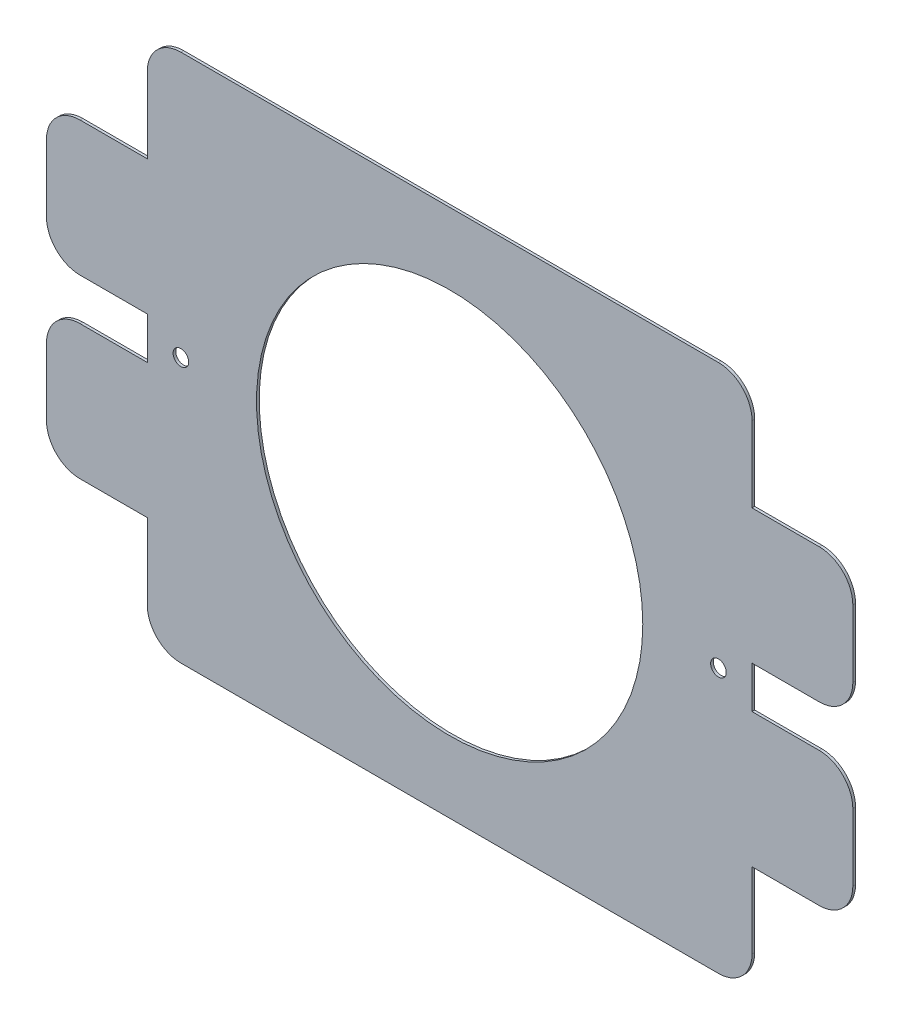
ISO-10303-21;
HEADER;
FILE_DESCRIPTION(('STEP AP214'),'2;1');
FILE_NAME('part.step','',(''),(''),'','','');
FILE_SCHEMA(('AUTOMOTIVE_DESIGN { 1 0 10303 214 1 1 1 1 }'));
ENDSEC;
DATA;
#1=APPLICATION_CONTEXT('core data for automotive mechanical design processes');
#2=APPLICATION_PROTOCOL_DEFINITION('international standard','automotive_design',2000,#1);
#3=PRODUCT_CONTEXT('',#1,'mechanical');
#4=PRODUCT('Part','Part','',(#3));
#5=PRODUCT_RELATED_PRODUCT_CATEGORY('part','',(#4));
#6=PRODUCT_DEFINITION_FORMATION('','',#4);
#7=PRODUCT_DEFINITION_CONTEXT('part definition',#1,'design');
#8=PRODUCT_DEFINITION('design','',#6,#7);
#9=PRODUCT_DEFINITION_SHAPE('','',#8);
#10=(LENGTH_UNIT() NAMED_UNIT(*) SI_UNIT(.MILLI.,.METRE.));
#11=(NAMED_UNIT(*) PLANE_ANGLE_UNIT() SI_UNIT($,.RADIAN.));
#12=(NAMED_UNIT(*) SI_UNIT($,.STERADIAN.) SOLID_ANGLE_UNIT());
#13=UNCERTAINTY_MEASURE_WITH_UNIT(LENGTH_MEASURE(1.E-05),#10,'distance_accuracy_value','');
#14=(GEOMETRIC_REPRESENTATION_CONTEXT(3) GLOBAL_UNCERTAINTY_ASSIGNED_CONTEXT((#13)) GLOBAL_UNIT_ASSIGNED_CONTEXT((#10,
#11,#12)) REPRESENTATION_CONTEXT('',''));
#15=CARTESIAN_POINT('',(0.,0.,0.));
#16=DIRECTION('',(0.,0.,1.));
#17=DIRECTION('',(1.,0.,0.));
#18=AXIS2_PLACEMENT_3D('',#15,#16,#17);
#19=CARTESIAN_POINT('',(57.15,0.,0.508));
#20=DIRECTION('',(1.,0.,0.));
#21=DIRECTION('',(0.,1.,0.));
#22=AXIS2_PLACEMENT_3D('',#19,#20,#21);
#23=PLANE('',#22);
#24=DIRECTION('',(0.,-1.,0.));
#25=VECTOR('',#24,1.);
#26=CARTESIAN_POINT('',(57.15,0.,0.));
#27=LINE('',#26,#25);
#28=CARTESIAN_POINT('',(57.15,43.65,0.));
#29=VERTEX_POINT('',#28);
#30=CARTESIAN_POINT('',(57.15,29.3666666666667,0.));
#31=VERTEX_POINT('',#30);
#32=EDGE_CURVE('E474',#29,#31,#27,.T.);
#33=ORIENTED_EDGE('',*,*,#32,.F.);
#34=DIRECTION('',(0.,0.,-1.));
#35=VECTOR('',#34,1.);
#36=CARTESIAN_POINT('',(57.15,43.65,0.508));
#37=LINE('',#36,#35);
#38=CARTESIAN_POINT('',(57.15,43.65,0.508));
#39=VERTEX_POINT('',#38);
#40=EDGE_CURVE('E429',#29,#39,#37,.F.);
#41=ORIENTED_EDGE('',*,*,#40,.T.);
#42=DIRECTION('',(0.,-1.,0.));
#43=VECTOR('',#42,1.);
#44=CARTESIAN_POINT('',(57.15,0.,0.508));
#45=LINE('',#44,#43);
#46=CARTESIAN_POINT('',(57.15,29.3666666666667,0.508));
#47=VERTEX_POINT('',#46);
#48=EDGE_CURVE('E698',#39,#47,#45,.T.);
#49=ORIENTED_EDGE('',*,*,#48,.T.);
#50=DIRECTION('',(0.,0.,-1.));
#51=VECTOR('',#50,1.);
#52=CARTESIAN_POINT('',(57.15,29.3666666666667,0.508));
#53=LINE('',#52,#51);
#54=EDGE_CURVE('E512',#47,#31,#53,.T.);
#55=ORIENTED_EDGE('',*,*,#54,.T.);
#56=EDGE_LOOP('',(#33,#41,#49,#55));
#57=FACE_BOUND('',#56,.T.);
#58=ADVANCED_FACE('F45',(#57),#23,.T.);
#59=CARTESIAN_POINT('',(0.,50.,0.508));
#60=DIRECTION('',(0.,1.,0.));
#61=DIRECTION('',(-1.,0.,0.));
#62=AXIS2_PLACEMENT_3D('',#59,#60,#61);
#63=PLANE('',#62);
#64=DIRECTION('',(1.,0.,0.));
#65=VECTOR('',#64,1.);
#66=CARTESIAN_POINT('',(0.,50.,0.));
#67=LINE('',#66,#65);
#68=CARTESIAN_POINT('',(-50.8,50.,0.));
#69=VERTEX_POINT('',#68);
#70=CARTESIAN_POINT('',(50.8,50.,0.));
#71=VERTEX_POINT('',#70);
#72=EDGE_CURVE('E485',#69,#71,#67,.T.);
#73=ORIENTED_EDGE('',*,*,#72,.F.);
#74=DIRECTION('',(0.,0.,-1.));
#75=VECTOR('',#74,1.);
#76=CARTESIAN_POINT('',(-50.8,50.,0.508));
#77=LINE('',#76,#75);
#78=CARTESIAN_POINT('',(-50.8,50.,0.508));
#79=VERTEX_POINT('',#78);
#80=EDGE_CURVE('E426',#69,#79,#77,.F.);
#81=ORIENTED_EDGE('',*,*,#80,.T.);
#82=DIRECTION('',(1.,0.,0.));
#83=VECTOR('',#82,1.);
#84=CARTESIAN_POINT('',(0.,50.,0.508));
#85=LINE('',#84,#83);
#86=CARTESIAN_POINT('',(50.8,50.,0.508));
#87=VERTEX_POINT('',#86);
#88=EDGE_CURVE('E269',#79,#87,#85,.T.);
#89=ORIENTED_EDGE('',*,*,#88,.T.);
#90=DIRECTION('',(0.,0.,-1.));
#91=VECTOR('',#90,1.);
#92=CARTESIAN_POINT('',(50.8,50.,0.508));
#93=LINE('',#92,#91);
#94=EDGE_CURVE('E422',#87,#71,#93,.T.);
#95=ORIENTED_EDGE('',*,*,#94,.T.);
#96=EDGE_LOOP('',(#73,#81,#89,#95));
#97=FACE_BOUND('',#96,.T.);
#98=ADVANCED_FACE('F654',(#97),#63,.T.);
#99=CARTESIAN_POINT('',(-57.15,0.,0.508));
#100=DIRECTION('',(1.,0.,0.));
#101=DIRECTION('',(0.,1.,0.));
#102=AXIS2_PLACEMENT_3D('',#99,#100,#101);
#103=PLANE('',#102);
#104=DIRECTION('',(0.,-1.,0.));
#105=VECTOR('',#104,1.);
#106=CARTESIAN_POINT('',(-57.15,0.,0.508));
#107=LINE('',#106,#105);
#108=CARTESIAN_POINT('',(-57.15,43.65,0.508));
#109=VERTEX_POINT('',#108);
#110=CARTESIAN_POINT('',(-57.15,29.3666666666667,0.508));
#111=VERTEX_POINT('',#110);
#112=EDGE_CURVE('E255',#109,#111,#107,.T.);
#113=ORIENTED_EDGE('',*,*,#112,.F.);
#114=DIRECTION('',(0.,0.,-1.));
#115=VECTOR('',#114,1.);
#116=CARTESIAN_POINT('',(-57.15,43.65,0.));
#117=LINE('',#116,#115);
#118=CARTESIAN_POINT('',(-57.15,43.65,0.));
#119=VERTEX_POINT('',#118);
#120=EDGE_CURVE('E419',#109,#119,#117,.T.);
#121=ORIENTED_EDGE('',*,*,#120,.T.);
#122=DIRECTION('',(0.,-1.,0.));
#123=VECTOR('',#122,1.);
#124=CARTESIAN_POINT('',(-57.15,0.,0.));
#125=LINE('',#124,#123);
#126=CARTESIAN_POINT('',(-57.15,29.3666666666667,0.));
#127=VERTEX_POINT('',#126);
#128=EDGE_CURVE('E285',#119,#127,#125,.T.);
#129=ORIENTED_EDGE('',*,*,#128,.T.);
#130=DIRECTION('',(0.,0.,-1.));
#131=VECTOR('',#130,1.);
#132=CARTESIAN_POINT('',(-57.15,29.3666666666667,0.508));
#133=LINE('',#132,#131);
#134=EDGE_CURVE('E277',#111,#127,#133,.T.);
#135=ORIENTED_EDGE('',*,*,#134,.F.);
#136=EDGE_LOOP('',(#113,#121,#129,#135));
#137=FACE_BOUND('',#136,.T.);
#138=ADVANCED_FACE('F283',(#137),#103,.F.);
#139=CARTESIAN_POINT('',(0.,29.3666666666667,0.508));
#140=DIRECTION('',(0.,-1.,0.));
#141=DIRECTION('',(1.,0.,0.));
#142=AXIS2_PLACEMENT_3D('',#139,#140,#141);
#143=PLANE('',#142);
#144=DIRECTION('',(-1.,0.,0.));
#145=VECTOR('',#144,1.);
#146=CARTESIAN_POINT('',(0.,29.3666666666667,0.));
#147=LINE('',#146,#145);
#148=CARTESIAN_POINT('',(-69.8500000000001,29.3666666666667,0.));
#149=VERTEX_POINT('',#148);
#150=EDGE_CURVE('E558',#127,#149,#147,.T.);
#151=ORIENTED_EDGE('',*,*,#150,.T.);
#152=DIRECTION('',(0.,0.,-1.));
#153=VECTOR('',#152,1.);
#154=CARTESIAN_POINT('',(-69.8500000000001,29.3666666666667,0.508));
#155=LINE('',#154,#153);
#156=CARTESIAN_POINT('',(-69.8500000000001,29.3666666666667,0.508));
#157=VERTEX_POINT('',#156);
#158=EDGE_CURVE('E279',#149,#157,#155,.F.);
#159=ORIENTED_EDGE('',*,*,#158,.T.);
#160=DIRECTION('',(-1.,0.,0.));
#161=VECTOR('',#160,1.);
#162=CARTESIAN_POINT('',(0.,29.3666666666667,0.508));
#163=LINE('',#162,#161);
#164=EDGE_CURVE('E259',#111,#157,#163,.T.);
#165=ORIENTED_EDGE('',*,*,#164,.F.);
#166=ORIENTED_EDGE('',*,*,#134,.T.);
#167=EDGE_LOOP('',(#151,#159,#165,#166));
#168=FACE_BOUND('',#167,.T.);
#169=ADVANCED_FACE('F276',(#168),#143,.F.);
#170=CARTESIAN_POINT('',(-76.2,0.,0.508));
#171=DIRECTION('',(1.,0.,0.));
#172=DIRECTION('',(0.,1.,0.));
#173=AXIS2_PLACEMENT_3D('',#170,#171,#172);
#174=PLANE('',#173);
#175=DIRECTION('',(0.,-1.,0.));
#176=VECTOR('',#175,1.);
#177=CARTESIAN_POINT('',(-76.2,0.,0.));
#178=LINE('',#177,#176);
#179=CARTESIAN_POINT('',(-76.2,23.0166666666667,0.));
#180=VERTEX_POINT('',#179);
#181=CARTESIAN_POINT('',(-76.2,10.3166666666667,0.));
#182=VERTEX_POINT('',#181);
#183=EDGE_CURVE('E554',#180,#182,#178,.T.);
#184=ORIENTED_EDGE('',*,*,#183,.T.);
#185=DIRECTION('',(0.,0.,-1.));
#186=VECTOR('',#185,1.);
#187=CARTESIAN_POINT('',(-76.2,10.3166666666667,0.508));
#188=LINE('',#187,#186);
#189=CARTESIAN_POINT('',(-76.2,10.3166666666667,0.508));
#190=VERTEX_POINT('',#189);
#191=EDGE_CURVE('E414',#182,#190,#188,.F.);
#192=ORIENTED_EDGE('',*,*,#191,.T.);
#193=DIRECTION('',(0.,-1.,0.));
#194=VECTOR('',#193,1.);
#195=CARTESIAN_POINT('',(-76.2,0.,0.508));
#196=LINE('',#195,#194);
#197=CARTESIAN_POINT('',(-76.2,23.0166666666667,0.508));
#198=VERTEX_POINT('',#197);
#199=EDGE_CURVE('E281',#198,#190,#196,.T.);
#200=ORIENTED_EDGE('',*,*,#199,.F.);
#201=DIRECTION('',(0.,0.,-1.));
#202=VECTOR('',#201,1.);
#203=CARTESIAN_POINT('',(-76.2,23.0166666666667,0.508));
#204=LINE('',#203,#202);
#205=EDGE_CURVE('E410',#198,#180,#204,.T.);
#206=ORIENTED_EDGE('',*,*,#205,.T.);
#207=EDGE_LOOP('',(#184,#192,#200,#206));
#208=FACE_BOUND('',#207,.T.);
#209=ADVANCED_FACE('F583',(#208),#174,.F.);
#210=CARTESIAN_POINT('',(0.,3.96666666666683,0.508));
#211=DIRECTION('',(0.,-1.,0.));
#212=DIRECTION('',(1.,0.,0.));
#213=AXIS2_PLACEMENT_3D('',#210,#211,#212);
#214=PLANE('',#213);
#215=DIRECTION('',(-1.,0.,0.));
#216=VECTOR('',#215,1.);
#217=CARTESIAN_POINT('',(0.,3.96666666666683,0.508));
#218=LINE('',#217,#216);
#219=CARTESIAN_POINT('',(-57.15,3.96666666666672,0.508));
#220=VERTEX_POINT('',#219);
#221=CARTESIAN_POINT('',(-69.85,3.96666666666669,0.508));
#222=VERTEX_POINT('',#221);
#223=EDGE_CURVE('E587',#220,#222,#218,.T.);
#224=ORIENTED_EDGE('',*,*,#223,.T.);
#225=DIRECTION('',(0.,0.,-1.));
#226=VECTOR('',#225,1.);
#227=CARTESIAN_POINT('',(-69.85,3.96666666666669,0.));
#228=LINE('',#227,#226);
#229=CARTESIAN_POINT('',(-69.85,3.96666666666669,0.));
#230=VERTEX_POINT('',#229);
#231=EDGE_CURVE('E406',#222,#230,#228,.T.);
#232=ORIENTED_EDGE('',*,*,#231,.T.);
#233=DIRECTION('',(-1.,0.,0.));
#234=VECTOR('',#233,1.);
#235=CARTESIAN_POINT('',(0.,3.96666666666683,0.));
#236=LINE('',#235,#234);
#237=CARTESIAN_POINT('',(-57.15,3.96666666666672,0.));
#238=VERTEX_POINT('',#237);
#239=EDGE_CURVE('E548',#238,#230,#236,.T.);
#240=ORIENTED_EDGE('',*,*,#239,.F.);
#241=DIRECTION('',(0.,0.,-1.));
#242=VECTOR('',#241,1.);
#243=CARTESIAN_POINT('',(-57.15,3.96666666666672,0.508));
#244=LINE('',#243,#242);
#245=EDGE_CURVE('E289',#220,#238,#244,.T.);
#246=ORIENTED_EDGE('',*,*,#245,.F.);
#247=EDGE_LOOP('',(#224,#232,#240,#246));
#248=FACE_BOUND('',#247,.T.);
#249=ADVANCED_FACE('F818',(#248),#214,.T.);
#250=CARTESIAN_POINT('',(-57.15,-3.96666666666696,0.));
#251=VERTEX_POINT('',#250);
#252=EDGE_CURVE('E543',#238,#251,#125,.T.);
#253=ORIENTED_EDGE('',*,*,#252,.T.);
#254=DIRECTION('',(0.,0.,-1.));
#255=VECTOR('',#254,1.);
#256=CARTESIAN_POINT('',(-57.15,-3.96666666666696,0.508));
#257=LINE('',#256,#255);
#258=CARTESIAN_POINT('',(-57.15,-3.96666666666696,0.508));
#259=VERTEX_POINT('',#258);
#260=EDGE_CURVE('E295',#259,#251,#257,.T.);
#261=ORIENTED_EDGE('',*,*,#260,.F.);
#262=EDGE_CURVE('E272',#220,#259,#107,.T.);
#263=ORIENTED_EDGE('',*,*,#262,.F.);
#264=ORIENTED_EDGE('',*,*,#245,.T.);
#265=EDGE_LOOP('',(#253,#261,#263,#264));
#266=FACE_BOUND('',#265,.T.);
#267=ADVANCED_FACE('F544',(#266),#103,.F.);
#268=CARTESIAN_POINT('',(0.,-3.96666666666736,0.508));
#269=DIRECTION('',(0.,-1.,0.));
#270=DIRECTION('',(1.,0.,0.));
#271=AXIS2_PLACEMENT_3D('',#268,#269,#270);
#272=PLANE('',#271);
#273=DIRECTION('',(-1.,0.,0.));
#274=VECTOR('',#273,1.);
#275=CARTESIAN_POINT('',(0.,-3.96666666666736,0.));
#276=LINE('',#275,#274);
#277=CARTESIAN_POINT('',(-69.85,-3.96666666666694,0.));
#278=VERTEX_POINT('',#277);
#279=EDGE_CURVE('E535',#251,#278,#276,.T.);
#280=ORIENTED_EDGE('',*,*,#279,.T.);
#281=DIRECTION('',(0.,0.,-1.));
#282=VECTOR('',#281,1.);
#283=CARTESIAN_POINT('',(-69.85,-3.96666666666694,0.508));
#284=LINE('',#283,#282);
#285=CARTESIAN_POINT('',(-69.85,-3.96666666666694,0.508));
#286=VERTEX_POINT('',#285);
#287=EDGE_CURVE('E403',#278,#286,#284,.F.);
#288=ORIENTED_EDGE('',*,*,#287,.T.);
#289=DIRECTION('',(-1.,0.,0.));
#290=VECTOR('',#289,1.);
#291=CARTESIAN_POINT('',(0.,-3.96666666666736,0.508));
#292=LINE('',#291,#290);
#293=EDGE_CURVE('E538',#259,#286,#292,.T.);
#294=ORIENTED_EDGE('',*,*,#293,.F.);
#295=ORIENTED_EDGE('',*,*,#260,.T.);
#296=EDGE_LOOP('',(#280,#288,#294,#295));
#297=FACE_BOUND('',#296,.T.);
#298=ADVANCED_FACE('F534',(#297),#272,.F.);
#299=CARTESIAN_POINT('',(-76.2,0.,0.508));
#300=DIRECTION('',(1.,0.,0.));
#301=DIRECTION('',(0.,1.,0.));
#302=AXIS2_PLACEMENT_3D('',#299,#300,#301);
#303=PLANE('',#302);
#304=DIRECTION('',(0.,-1.,0.));
#305=VECTOR('',#304,1.);
#306=CARTESIAN_POINT('',(-76.2,0.,0.));
#307=LINE('',#306,#305);
#308=CARTESIAN_POINT('',(-76.2,-10.3166666666669,0.));
#309=VERTEX_POINT('',#308);
#310=CARTESIAN_POINT('',(-76.2,-23.0166666666669,0.));
#311=VERTEX_POINT('',#310);
#312=EDGE_CURVE('E552',#309,#311,#307,.T.);
#313=ORIENTED_EDGE('',*,*,#312,.T.);
#314=DIRECTION('',(0.,0.,-1.));
#315=VECTOR('',#314,1.);
#316=CARTESIAN_POINT('',(-76.2,-23.0166666666669,0.508));
#317=LINE('',#316,#315);
#318=CARTESIAN_POINT('',(-76.2,-23.0166666666669,0.508));
#319=VERTEX_POINT('',#318);
#320=EDGE_CURVE('E400',#311,#319,#317,.F.);
#321=ORIENTED_EDGE('',*,*,#320,.T.);
#322=DIRECTION('',(0.,-1.,0.));
#323=VECTOR('',#322,1.);
#324=CARTESIAN_POINT('',(-76.2,0.,0.508));
#325=LINE('',#324,#323);
#326=CARTESIAN_POINT('',(-76.2,-10.3166666666669,0.508));
#327=VERTEX_POINT('',#326);
#328=EDGE_CURVE('E595',#327,#319,#325,.T.);
#329=ORIENTED_EDGE('',*,*,#328,.F.);
#330=DIRECTION('',(0.,0.,-1.));
#331=VECTOR('',#330,1.);
#332=CARTESIAN_POINT('',(-76.2,-10.3166666666669,0.508));
#333=LINE('',#332,#331);
#334=EDGE_CURVE('E396',#327,#309,#333,.T.);
#335=ORIENTED_EDGE('',*,*,#334,.T.);
#336=EDGE_LOOP('',(#313,#321,#329,#335));
#337=FACE_BOUND('',#336,.T.);
#338=ADVANCED_FACE('F800',(#337),#303,.F.);
#339=CARTESIAN_POINT('',(1.6045053882788E-13,-29.3666666666665,0.508));
#340=DIRECTION('',(0.,-1.,0.));
#341=DIRECTION('',(1.,0.,0.));
#342=AXIS2_PLACEMENT_3D('',#339,#340,#341);
#343=PLANE('',#342);
#344=DIRECTION('',(-1.,0.,0.));
#345=VECTOR('',#344,1.);
#346=CARTESIAN_POINT('',(1.6045053882788E-13,-29.3666666666665,0.508));
#347=LINE('',#346,#345);
#348=CARTESIAN_POINT('',(-57.15,-29.3666666666668,0.508));
#349=VERTEX_POINT('',#348);
#350=CARTESIAN_POINT('',(-69.85,-29.3666666666669,0.508));
#351=VERTEX_POINT('',#350);
#352=EDGE_CURVE('E599',#349,#351,#347,.T.);
#353=ORIENTED_EDGE('',*,*,#352,.T.);
#354=DIRECTION('',(0.,0.,-1.));
#355=VECTOR('',#354,1.);
#356=CARTESIAN_POINT('',(-69.85,-29.3666666666669,0.));
#357=LINE('',#356,#355);
#358=CARTESIAN_POINT('',(-69.85,-29.3666666666669,0.));
#359=VERTEX_POINT('',#358);
#360=EDGE_CURVE('E392',#351,#359,#357,.T.);
#361=ORIENTED_EDGE('',*,*,#360,.T.);
#362=DIRECTION('',(-1.,0.,0.));
#363=VECTOR('',#362,1.);
#364=CARTESIAN_POINT('',(1.6045053882788E-13,-29.3666666666665,0.));
#365=LINE('',#364,#363);
#366=CARTESIAN_POINT('',(-57.15,-29.3666666666668,0.));
#367=VERTEX_POINT('',#366);
#368=EDGE_CURVE('E561',#367,#359,#365,.T.);
#369=ORIENTED_EDGE('',*,*,#368,.F.);
#370=DIRECTION('',(0.,0.,-1.));
#371=VECTOR('',#370,1.);
#372=CARTESIAN_POINT('',(-57.15,-29.3666666666668,0.508));
#373=LINE('',#372,#371);
#374=EDGE_CURVE('E526',#349,#367,#373,.T.);
#375=ORIENTED_EDGE('',*,*,#374,.F.);
#376=EDGE_LOOP('',(#353,#361,#369,#375));
#377=FACE_BOUND('',#376,.T.);
#378=ADVANCED_FACE('F792',(#377),#343,.T.);
#379=CARTESIAN_POINT('',(-57.15,-43.65,0.));
#380=VERTEX_POINT('',#379);
#381=EDGE_CURVE('E480',#367,#380,#125,.T.);
#382=ORIENTED_EDGE('',*,*,#381,.T.);
#383=DIRECTION('',(0.,0.,-1.));
#384=VECTOR('',#383,1.);
#385=CARTESIAN_POINT('',(-57.15,-43.65,0.508));
#386=LINE('',#385,#384);
#387=CARTESIAN_POINT('',(-57.15,-43.65,0.508));
#388=VERTEX_POINT('',#387);
#389=EDGE_CURVE('E11',#380,#388,#386,.F.);
#390=ORIENTED_EDGE('',*,*,#389,.T.);
#391=EDGE_CURVE('E271',#349,#388,#107,.T.);
#392=ORIENTED_EDGE('',*,*,#391,.F.);
#393=ORIENTED_EDGE('',*,*,#374,.T.);
#394=EDGE_LOOP('',(#382,#390,#392,#393));
#395=FACE_BOUND('',#394,.T.);
#396=ADVANCED_FACE('F807',(#395),#103,.F.);
#397=CARTESIAN_POINT('',(0.,-50.,0.508));
#398=DIRECTION('',(0.,1.,0.));
#399=DIRECTION('',(-1.,0.,0.));
#400=AXIS2_PLACEMENT_3D('',#397,#398,#399);
#401=PLANE('',#400);
#402=DIRECTION('',(1.,0.,0.));
#403=VECTOR('',#402,1.);
#404=CARTESIAN_POINT('',(0.,-50.,0.));
#405=LINE('',#404,#403);
#406=CARTESIAN_POINT('',(-50.8,-50.,0.));
#407=VERTEX_POINT('',#406);
#408=CARTESIAN_POINT('',(50.8,-50.,0.));
#409=VERTEX_POINT('',#408);
#410=EDGE_CURVE('E449',#407,#409,#405,.T.);
#411=ORIENTED_EDGE('',*,*,#410,.T.);
#412=DIRECTION('',(0.,0.,-1.));
#413=VECTOR('',#412,1.);
#414=CARTESIAN_POINT('',(50.8,-50.,0.508));
#415=LINE('',#414,#413);
#416=CARTESIAN_POINT('',(50.8,-50.,0.508));
#417=VERTEX_POINT('',#416);
#418=EDGE_CURVE('E54',#409,#417,#415,.F.);
#419=ORIENTED_EDGE('',*,*,#418,.T.);
#420=DIRECTION('',(1.,0.,0.));
#421=VECTOR('',#420,1.);
#422=CARTESIAN_POINT('',(0.,-50.,0.508));
#423=LINE('',#422,#421);
#424=CARTESIAN_POINT('',(-50.8,-50.,0.508));
#425=VERTEX_POINT('',#424);
#426=EDGE_CURVE('E446',#425,#417,#423,.T.);
#427=ORIENTED_EDGE('',*,*,#426,.F.);
#428=DIRECTION('',(0.,0.,-1.));
#429=VECTOR('',#428,1.);
#430=CARTESIAN_POINT('',(-50.8,-50.,0.508));
#431=LINE('',#430,#429);
#432=EDGE_CURVE('E436',#425,#407,#431,.T.);
#433=ORIENTED_EDGE('',*,*,#432,.T.);
#434=EDGE_LOOP('',(#411,#419,#427,#433));
#435=FACE_BOUND('',#434,.T.);
#436=ADVANCED_FACE('F445',(#435),#401,.F.);
#437=CARTESIAN_POINT('',(57.15,-29.3666666666666,0.508));
#438=VERTEX_POINT('',#437);
#439=CARTESIAN_POINT('',(57.15,-43.65,0.508));
#440=VERTEX_POINT('',#439);
#441=EDGE_CURVE('E457',#438,#440,#45,.T.);
#442=ORIENTED_EDGE('',*,*,#441,.T.);
#443=DIRECTION('',(0.,0.,-1.));
#444=VECTOR('',#443,1.);
#445=CARTESIAN_POINT('',(57.15,-43.65,0.));
#446=LINE('',#445,#444);
#447=CARTESIAN_POINT('',(57.15,-43.65,0.));
#448=VERTEX_POINT('',#447);
#449=EDGE_CURVE('E432',#440,#448,#446,.T.);
#450=ORIENTED_EDGE('',*,*,#449,.T.);
#451=CARTESIAN_POINT('',(57.15,-29.3666666666666,0.));
#452=VERTEX_POINT('',#451);
#453=EDGE_CURVE('E465',#452,#448,#27,.T.);
#454=ORIENTED_EDGE('',*,*,#453,.F.);
#455=DIRECTION('',(0.,0.,-1.));
#456=VECTOR('',#455,1.);
#457=CARTESIAN_POINT('',(57.15,-29.3666666666666,0.508));
#458=LINE('',#457,#456);
#459=EDGE_CURVE('E523',#438,#452,#458,.T.);
#460=ORIENTED_EDGE('',*,*,#459,.F.);
#461=EDGE_LOOP('',(#442,#450,#454,#460));
#462=FACE_BOUND('',#461,.T.);
#463=ADVANCED_FACE('F464',(#462),#23,.T.);
#464=CARTESIAN_POINT('',(-2.83462618595919E-13,-29.3666666666661,0.508));
#465=DIRECTION('',(0.,1.,0.));
#466=DIRECTION('',(-1.,0.,0.));
#467=AXIS2_PLACEMENT_3D('',#464,#465,#466);
#468=PLANE('',#467);
#469=DIRECTION('',(1.,0.,0.));
#470=VECTOR('',#469,1.);
#471=CARTESIAN_POINT('',(-2.83462618595919E-13,-29.3666666666661,0.));
#472=LINE('',#471,#470);
#473=CARTESIAN_POINT('',(69.8499999999999,-29.3666666666668,0.));
#474=VERTEX_POINT('',#473);
#475=EDGE_CURVE('E471',#452,#474,#472,.T.);
#476=ORIENTED_EDGE('',*,*,#475,.T.);
#477=DIRECTION('',(0.,0.,-1.));
#478=VECTOR('',#477,1.);
#479=CARTESIAN_POINT('',(69.8499999999999,-29.3666666666668,0.508));
#480=LINE('',#479,#478);
#481=CARTESIAN_POINT('',(69.8499999999999,-29.3666666666668,0.508));
#482=VERTEX_POINT('',#481);
#483=EDGE_CURVE('E338',#474,#482,#480,.F.);
#484=ORIENTED_EDGE('',*,*,#483,.T.);
#485=DIRECTION('',(1.,0.,0.));
#486=VECTOR('',#485,1.);
#487=CARTESIAN_POINT('',(-2.83462618595919E-13,-29.3666666666661,0.508));
#488=LINE('',#487,#486);
#489=EDGE_CURVE('E603',#438,#482,#488,.T.);
#490=ORIENTED_EDGE('',*,*,#489,.F.);
#491=ORIENTED_EDGE('',*,*,#459,.T.);
#492=EDGE_LOOP('',(#476,#484,#490,#491));
#493=FACE_BOUND('',#492,.T.);
#494=ADVANCED_FACE('F666',(#493),#468,.F.);
#495=CARTESIAN_POINT('',(76.2,0.,0.508));
#496=DIRECTION('',(1.,0.,0.));
#497=DIRECTION('',(0.,0.,-1.));
#498=AXIS2_PLACEMENT_3D('',#495,#496,#497);
#499=PLANE('',#498);
#500=DIRECTION('',(0.,-1.,0.));
#501=VECTOR('',#500,1.);
#502=CARTESIAN_POINT('',(76.2,0.,0.508));
#503=LINE('',#502,#501);
#504=CARTESIAN_POINT('',(76.2,-10.3166666666669,0.508));
#505=VERTEX_POINT('',#504);
#506=CARTESIAN_POINT('',(76.2,-23.0166666666668,0.508));
#507=VERTEX_POINT('',#506);
#508=EDGE_CURVE('E606',#505,#507,#503,.T.);
#509=ORIENTED_EDGE('',*,*,#508,.T.);
#510=DIRECTION('',(0.,0.,-1.));
#511=VECTOR('',#510,1.);
#512=CARTESIAN_POINT('',(76.2,-23.0166666666668,0.));
#513=LINE('',#512,#511);
#514=CARTESIAN_POINT('',(76.2,-23.0166666666668,0.));
#515=VERTEX_POINT('',#514);
#516=EDGE_CURVE('E293',#507,#515,#513,.T.);
#517=ORIENTED_EDGE('',*,*,#516,.T.);
#518=DIRECTION('',(0.,-1.,0.));
#519=VECTOR('',#518,1.);
#520=CARTESIAN_POINT('',(76.2,0.,0.));
#521=LINE('',#520,#519);
#522=CARTESIAN_POINT('',(76.2,-10.3166666666669,0.));
#523=VERTEX_POINT('',#522);
#524=EDGE_CURVE('E478',#523,#515,#521,.T.);
#525=ORIENTED_EDGE('',*,*,#524,.F.);
#526=DIRECTION('',(0.,0.,-1.));
#527=VECTOR('',#526,1.);
#528=CARTESIAN_POINT('',(76.2,-10.3166666666669,0.508));
#529=LINE('',#528,#527);
#530=EDGE_CURVE('E288',#523,#505,#529,.F.);
#531=ORIENTED_EDGE('',*,*,#530,.T.);
#532=EDGE_LOOP('',(#509,#517,#525,#531));
#533=FACE_BOUND('',#532,.T.);
#534=ADVANCED_FACE('F675',(#533),#499,.T.);
#535=CARTESIAN_POINT('',(0.,-3.96666666666754,0.508));
#536=DIRECTION('',(0.,1.,0.));
#537=DIRECTION('',(-1.,0.,0.));
#538=AXIS2_PLACEMENT_3D('',#535,#536,#537);
#539=PLANE('',#538);
#540=DIRECTION('',(1.,0.,0.));
#541=VECTOR('',#540,1.);
#542=CARTESIAN_POINT('',(0.,-3.96666666666754,0.508));
#543=LINE('',#542,#541);
#544=CARTESIAN_POINT('',(57.15,-3.96666666666691,0.508));
#545=VERTEX_POINT('',#544);
#546=CARTESIAN_POINT('',(69.8499999999999,-3.96666666666688,0.508));
#547=VERTEX_POINT('',#546);
#548=EDGE_CURVE('E610',#545,#547,#543,.T.);
#549=ORIENTED_EDGE('',*,*,#548,.T.);
#550=DIRECTION('',(0.,0.,-1.));
#551=VECTOR('',#550,1.);
#552=CARTESIAN_POINT('',(69.8499999999999,-3.96666666666688,0.508));
#553=LINE('',#552,#551);
#554=CARTESIAN_POINT('',(69.8499999999999,-3.96666666666688,0.));
#555=VERTEX_POINT('',#554);
#556=EDGE_CURVE('E388',#547,#555,#553,.T.);
#557=ORIENTED_EDGE('',*,*,#556,.T.);
#558=DIRECTION('',(1.,0.,0.));
#559=VECTOR('',#558,1.);
#560=CARTESIAN_POINT('',(0.,-3.96666666666754,0.));
#561=LINE('',#560,#559);
#562=CARTESIAN_POINT('',(57.15,-3.96666666666691,0.));
#563=VERTEX_POINT('',#562);
#564=EDGE_CURVE('E490',#563,#555,#561,.T.);
#565=ORIENTED_EDGE('',*,*,#564,.F.);
#566=DIRECTION('',(0.,0.,-1.));
#567=VECTOR('',#566,1.);
#568=CARTESIAN_POINT('',(57.15,-3.96666666666691,0.508));
#569=LINE('',#568,#567);
#570=EDGE_CURVE('E520',#545,#563,#569,.T.);
#571=ORIENTED_EDGE('',*,*,#570,.F.);
#572=EDGE_LOOP('',(#549,#557,#565,#571));
#573=FACE_BOUND('',#572,.T.);
#574=ADVANCED_FACE('F668',(#573),#539,.T.);
#575=CARTESIAN_POINT('',(57.15,3.96666666666688,0.));
#576=VERTEX_POINT('',#575);
#577=EDGE_CURVE('E475',#576,#563,#27,.T.);
#578=ORIENTED_EDGE('',*,*,#577,.F.);
#579=DIRECTION('',(0.,0.,-1.));
#580=VECTOR('',#579,1.);
#581=CARTESIAN_POINT('',(57.15,3.96666666666688,0.508));
#582=LINE('',#581,#580);
#583=CARTESIAN_POINT('',(57.15,3.96666666666688,0.508));
#584=VERTEX_POINT('',#583);
#585=EDGE_CURVE('E516',#584,#576,#582,.T.);
#586=ORIENTED_EDGE('',*,*,#585,.F.);
#587=EDGE_CURVE('E614',#584,#545,#45,.T.);
#588=ORIENTED_EDGE('',*,*,#587,.T.);
#589=ORIENTED_EDGE('',*,*,#570,.T.);
#590=EDGE_LOOP('',(#578,#586,#588,#589));
#591=FACE_BOUND('',#590,.T.);
#592=ADVANCED_FACE('F657',(#591),#23,.T.);
#593=CARTESIAN_POINT('',(0.,3.96666666666723,0.508));
#594=DIRECTION('',(0.,1.,0.));
#595=DIRECTION('',(-1.,0.,0.));
#596=AXIS2_PLACEMENT_3D('',#593,#594,#595);
#597=PLANE('',#596);
#598=DIRECTION('',(1.,0.,0.));
#599=VECTOR('',#598,1.);
#600=CARTESIAN_POINT('',(0.,3.96666666666723,0.));
#601=LINE('',#600,#599);
#602=CARTESIAN_POINT('',(69.8499999999999,3.9666666666668,0.));
#603=VERTEX_POINT('',#602);
#604=EDGE_CURVE('E489',#576,#603,#601,.T.);
#605=ORIENTED_EDGE('',*,*,#604,.T.);
#606=DIRECTION('',(0.,0.,-1.));
#607=VECTOR('',#606,1.);
#608=CARTESIAN_POINT('',(69.8499999999999,3.9666666666668,0.508));
#609=LINE('',#608,#607);
#610=CARTESIAN_POINT('',(69.8499999999999,3.9666666666668,0.508));
#611=VERTEX_POINT('',#610);
#612=EDGE_CURVE('E385',#603,#611,#609,.F.);
#613=ORIENTED_EDGE('',*,*,#612,.T.);
#614=DIRECTION('',(1.,0.,0.));
#615=VECTOR('',#614,1.);
#616=CARTESIAN_POINT('',(0.,3.96666666666723,0.508));
#617=LINE('',#616,#615);
#618=EDGE_CURVE('E615',#584,#611,#617,.T.);
#619=ORIENTED_EDGE('',*,*,#618,.F.);
#620=ORIENTED_EDGE('',*,*,#585,.T.);
#621=EDGE_LOOP('',(#605,#613,#619,#620));
#622=FACE_BOUND('',#621,.T.);
#623=ADVANCED_FACE('F648',(#622),#597,.F.);
#624=CARTESIAN_POINT('',(76.2,0.,0.508));
#625=DIRECTION('',(1.,0.,0.));
#626=DIRECTION('',(0.,1.,0.));
#627=AXIS2_PLACEMENT_3D('',#624,#625,#626);
#628=PLANE('',#627);
#629=DIRECTION('',(0.,-1.,0.));
#630=VECTOR('',#629,1.);
#631=CARTESIAN_POINT('',(76.2,0.,0.));
#632=LINE('',#631,#630);
#633=CARTESIAN_POINT('',(76.1999999999999,23.0166666666667,0.));
#634=VERTEX_POINT('',#633);
#635=CARTESIAN_POINT('',(76.1999999999999,10.3166666666668,0.));
#636=VERTEX_POINT('',#635);
#637=EDGE_CURVE('E497',#634,#636,#632,.T.);
#638=ORIENTED_EDGE('',*,*,#637,.F.);
#639=DIRECTION('',(0.,0.,-1.));
#640=VECTOR('',#639,1.);
#641=CARTESIAN_POINT('',(76.1999999999999,23.0166666666667,0.508));
#642=LINE('',#641,#640);
#643=CARTESIAN_POINT('',(76.1999999999999,23.0166666666667,0.508));
#644=VERTEX_POINT('',#643);
#645=EDGE_CURVE('E382',#634,#644,#642,.F.);
#646=ORIENTED_EDGE('',*,*,#645,.T.);
#647=DIRECTION('',(0.,-1.,0.));
#648=VECTOR('',#647,1.);
#649=CARTESIAN_POINT('',(76.2,0.,0.508));
#650=LINE('',#649,#648);
#651=CARTESIAN_POINT('',(76.1999999999999,10.3166666666668,0.508));
#652=VERTEX_POINT('',#651);
#653=EDGE_CURVE('E618',#644,#652,#650,.T.);
#654=ORIENTED_EDGE('',*,*,#653,.T.);
#655=DIRECTION('',(0.,0.,-1.));
#656=VECTOR('',#655,1.);
#657=CARTESIAN_POINT('',(76.1999999999999,10.3166666666668,0.));
#658=LINE('',#657,#656);
#659=EDGE_CURVE('E378',#652,#636,#658,.T.);
#660=ORIENTED_EDGE('',*,*,#659,.T.);
#661=EDGE_LOOP('',(#638,#646,#654,#660));
#662=FACE_BOUND('',#661,.T.);
#663=ADVANCED_FACE('F638',(#662),#628,.T.);
#664=CARTESIAN_POINT('',(0.,0.,0.508));
#665=DIRECTION('',(0.,0.,-1.));
#666=DIRECTION('',(-1.,0.,0.));
#667=AXIS2_PLACEMENT_3D('',#664,#665,#666);
#668=CYLINDRICAL_SURFACE('',#667,36.5);
#669=CARTESIAN_POINT('',(0.,0.,0.508));
#670=DIRECTION('',(0.,0.,1.));
#671=DIRECTION('',(1.,0.,0.));
#672=AXIS2_PLACEMENT_3D('',#669,#670,#671);
#673=CIRCLE('',#672,36.5);
#674=CARTESIAN_POINT('',(36.5,0.,0.508));
#675=VERTEX_POINT('',#674);
#676=EDGE_CURVE('E702',#675,#675,#673,.T.);
#677=ORIENTED_EDGE('',*,*,#676,.T.);
#678=EDGE_LOOP('',(#677));
#679=FACE_BOUND('',#678,.T.);
#680=CARTESIAN_POINT('',(0.,0.,0.));
#681=DIRECTION('',(0.,0.,1.));
#682=DIRECTION('',(1.,0.,0.));
#683=AXIS2_PLACEMENT_3D('',#680,#681,#682);
#684=CIRCLE('',#683,36.5);
#685=CARTESIAN_POINT('',(36.5,0.,0.));
#686=VERTEX_POINT('',#685);
#687=EDGE_CURVE('E486',#686,#686,#684,.T.);
#688=ORIENTED_EDGE('',*,*,#687,.F.);
#689=EDGE_LOOP('',(#688));
#690=FACE_BOUND('',#689,.T.);
#691=ADVANCED_FACE('F635',(#679,#690),#668,.F.);
#692=CARTESIAN_POINT('',(-50.8,0.,0.508));
#693=DIRECTION('',(0.,0.,-1.));
#694=DIRECTION('',(-1.,0.,0.));
#695=AXIS2_PLACEMENT_3D('',#692,#693,#694);
#696=CYLINDRICAL_SURFACE('',#695,1.475);
#697=CARTESIAN_POINT('',(-50.8,0.,0.508));
#698=DIRECTION('',(0.,0.,1.));
#699=DIRECTION('',(1.,0.,0.));
#700=AXIS2_PLACEMENT_3D('',#697,#698,#699);
#701=CIRCLE('',#700,1.475);
#702=CARTESIAN_POINT('',(-49.325,0.,0.508));
#703=VERTEX_POINT('',#702);
#704=EDGE_CURVE('E709',#703,#703,#701,.T.);
#705=ORIENTED_EDGE('',*,*,#704,.T.);
#706=EDGE_LOOP('',(#705));
#707=FACE_BOUND('',#706,.T.);
#708=CARTESIAN_POINT('',(-50.8,0.,0.));
#709=DIRECTION('',(0.,0.,1.));
#710=DIRECTION('',(1.,0.,0.));
#711=AXIS2_PLACEMENT_3D('',#708,#709,#710);
#712=CIRCLE('',#711,1.475);
#713=CARTESIAN_POINT('',(-49.325,0.,0.));
#714=VERTEX_POINT('',#713);
#715=EDGE_CURVE('E627',#714,#714,#712,.T.);
#716=ORIENTED_EDGE('',*,*,#715,.F.);
#717=EDGE_LOOP('',(#716));
#718=FACE_BOUND('',#717,.T.);
#719=ADVANCED_FACE('F637',(#707,#718),#696,.F.);
#720=CARTESIAN_POINT('',(50.8,0.,0.508));
#721=DIRECTION('',(0.,0.,-1.));
#722=DIRECTION('',(-1.,0.,0.));
#723=AXIS2_PLACEMENT_3D('',#720,#721,#722);
#724=CYLINDRICAL_SURFACE('',#723,1.47500000000001);
#725=CARTESIAN_POINT('',(50.8,0.,0.508));
#726=DIRECTION('',(0.,0.,1.));
#727=DIRECTION('',(1.,0.,0.));
#728=AXIS2_PLACEMENT_3D('',#725,#726,#727);
#729=CIRCLE('',#728,1.47500000000001);
#730=CARTESIAN_POINT('',(52.275,0.,0.508));
#731=VERTEX_POINT('',#730);
#732=EDGE_CURVE('E511',#731,#731,#729,.T.);
#733=ORIENTED_EDGE('',*,*,#732,.T.);
#734=EDGE_LOOP('',(#733));
#735=FACE_BOUND('',#734,.T.);
#736=CARTESIAN_POINT('',(50.8,0.,0.));
#737=DIRECTION('',(0.,0.,1.));
#738=DIRECTION('',(1.,0.,0.));
#739=AXIS2_PLACEMENT_3D('',#736,#737,#738);
#740=CIRCLE('',#739,1.47500000000001);
#741=CARTESIAN_POINT('',(52.275,0.,0.));
#742=VERTEX_POINT('',#741);
#743=EDGE_CURVE('E623',#742,#742,#740,.T.);
#744=ORIENTED_EDGE('',*,*,#743,.F.);
#745=EDGE_LOOP('',(#744));
#746=FACE_BOUND('',#745,.T.);
#747=ADVANCED_FACE('F645',(#735,#746),#724,.F.);
#748=CARTESIAN_POINT('',(0.,29.3666666666665,0.508));
#749=DIRECTION('',(0.,1.,0.));
#750=DIRECTION('',(-1.,0.,0.));
#751=AXIS2_PLACEMENT_3D('',#748,#749,#750);
#752=PLANE('',#751);
#753=DIRECTION('',(1.,0.,0.));
#754=VECTOR('',#753,1.);
#755=CARTESIAN_POINT('',(0.,29.3666666666665,0.508));
#756=LINE('',#755,#754);
#757=CARTESIAN_POINT('',(69.8499999999999,29.3666666666667,0.508));
#758=VERTEX_POINT('',#757);
#759=EDGE_CURVE('E517',#47,#758,#756,.T.);
#760=ORIENTED_EDGE('',*,*,#759,.T.);
#761=DIRECTION('',(0.,0.,-1.));
#762=VECTOR('',#761,1.);
#763=CARTESIAN_POINT('',(69.8499999999999,29.3666666666667,0.508));
#764=LINE('',#763,#762);
#765=CARTESIAN_POINT('',(69.8499999999999,29.3666666666667,0.));
#766=VERTEX_POINT('',#765);
#767=EDGE_CURVE('E374',#758,#766,#764,.T.);
#768=ORIENTED_EDGE('',*,*,#767,.T.);
#769=DIRECTION('',(1.,0.,0.));
#770=VECTOR('',#769,1.);
#771=CARTESIAN_POINT('',(0.,29.3666666666665,0.));
#772=LINE('',#771,#770);
#773=EDGE_CURVE('E507',#31,#766,#772,.T.);
#774=ORIENTED_EDGE('',*,*,#773,.F.);
#775=ORIENTED_EDGE('',*,*,#54,.F.);
#776=EDGE_LOOP('',(#760,#768,#774,#775));
#777=FACE_BOUND('',#776,.T.);
#778=ADVANCED_FACE('F723',(#777),#752,.T.);
#779=CARTESIAN_POINT('',(0.,0.,0.508));
#780=DIRECTION('',(0.,0.,1.));
#781=DIRECTION('',(1.,0.,0.));
#782=AXIS2_PLACEMENT_3D('',#779,#780,#781);
#783=PLANE('',#782);
#784=ORIENTED_EDGE('',*,*,#732,.F.);
#785=EDGE_LOOP('',(#784));
#786=FACE_BOUND('',#785,.T.);
#787=ORIENTED_EDGE('',*,*,#704,.F.);
#788=EDGE_LOOP('',(#787));
#789=FACE_BOUND('',#788,.T.);
#790=ORIENTED_EDGE('',*,*,#676,.F.);
#791=EDGE_LOOP('',(#790));
#792=FACE_BOUND('',#791,.T.);
#793=ORIENTED_EDGE('',*,*,#489,.T.);
#794=CARTESIAN_POINT('',(69.85,-23.0166666666668,0.508));
#795=DIRECTION('',(0.,0.,1.));
#796=DIRECTION('',(1.,0.,0.));
#797=AXIS2_PLACEMENT_3D('',#794,#795,#796);
#798=CIRCLE('',#797,6.35);
#799=EDGE_CURVE('E371',#482,#507,#798,.T.);
#800=ORIENTED_EDGE('',*,*,#799,.T.);
#801=ORIENTED_EDGE('',*,*,#508,.F.);
#802=CARTESIAN_POINT('',(69.85,-10.3166666666669,0.508));
#803=DIRECTION('',(0.,0.,1.));
#804=DIRECTION('',(1.,0.,0.));
#805=AXIS2_PLACEMENT_3D('',#802,#803,#804);
#806=CIRCLE('',#805,6.35);
#807=EDGE_CURVE('E364',#505,#547,#806,.T.);
#808=ORIENTED_EDGE('',*,*,#807,.T.);
#809=ORIENTED_EDGE('',*,*,#548,.F.);
#810=ORIENTED_EDGE('',*,*,#587,.F.);
#811=ORIENTED_EDGE('',*,*,#618,.T.);
#812=CARTESIAN_POINT('',(69.85,10.3166666666668,0.508));
#813=DIRECTION('',(0.,0.,1.));
#814=DIRECTION('',(1.,0.,0.));
#815=AXIS2_PLACEMENT_3D('',#812,#813,#814);
#816=CIRCLE('',#815,6.35);
#817=EDGE_CURVE('E67',#611,#652,#816,.T.);
#818=ORIENTED_EDGE('',*,*,#817,.T.);
#819=ORIENTED_EDGE('',*,*,#653,.F.);
#820=CARTESIAN_POINT('',(69.8499999999999,23.0166666666667,0.508));
#821=DIRECTION('',(0.,0.,1.));
#822=DIRECTION('',(1.,0.,0.));
#823=AXIS2_PLACEMENT_3D('',#820,#821,#822);
#824=CIRCLE('',#823,6.35);
#825=EDGE_CURVE('E61',#644,#758,#824,.T.);
#826=ORIENTED_EDGE('',*,*,#825,.T.);
#827=ORIENTED_EDGE('',*,*,#759,.F.);
#828=ORIENTED_EDGE('',*,*,#48,.F.);
#829=CARTESIAN_POINT('',(50.8,43.65,0.508));
#830=DIRECTION('',(0.,0.,1.));
#831=DIRECTION('',(1.,0.,0.));
#832=AXIS2_PLACEMENT_3D('',#829,#830,#831);
#833=CIRCLE('',#832,6.35);
#834=EDGE_CURVE('E347',#39,#87,#833,.T.);
#835=ORIENTED_EDGE('',*,*,#834,.T.);
#836=ORIENTED_EDGE('',*,*,#88,.F.);
#837=CARTESIAN_POINT('',(-50.8,43.65,0.508));
#838=DIRECTION('',(0.,0.,1.));
#839=DIRECTION('',(1.,0.,0.));
#840=AXIS2_PLACEMENT_3D('',#837,#838,#839);
#841=CIRCLE('',#840,6.35);
#842=EDGE_CURVE('E263',#79,#109,#841,.T.);
#843=ORIENTED_EDGE('',*,*,#842,.T.);
#844=ORIENTED_EDGE('',*,*,#112,.T.);
#845=ORIENTED_EDGE('',*,*,#164,.T.);
#846=CARTESIAN_POINT('',(-69.8500000000001,23.0166666666667,0.508));
#847=DIRECTION('',(0.,0.,1.));
#848=DIRECTION('',(1.,0.,0.));
#849=AXIS2_PLACEMENT_3D('',#846,#847,#848);
#850=CIRCLE('',#849,6.35);
#851=EDGE_CURVE('E352',#157,#198,#850,.T.);
#852=ORIENTED_EDGE('',*,*,#851,.T.);
#853=ORIENTED_EDGE('',*,*,#199,.T.);
#854=CARTESIAN_POINT('',(-69.85,10.3166666666667,0.508));
#855=DIRECTION('',(0.,0.,1.));
#856=DIRECTION('',(1.,0.,0.));
#857=AXIS2_PLACEMENT_3D('',#854,#855,#856);
#858=CIRCLE('',#857,6.35);
#859=EDGE_CURVE('E355',#190,#222,#858,.T.);
#860=ORIENTED_EDGE('',*,*,#859,.T.);
#861=ORIENTED_EDGE('',*,*,#223,.F.);
#862=ORIENTED_EDGE('',*,*,#262,.T.);
#863=ORIENTED_EDGE('',*,*,#293,.T.);
#864=CARTESIAN_POINT('',(-69.85,-10.3166666666669,0.508));
#865=DIRECTION('',(0.,0.,1.));
#866=DIRECTION('',(1.,0.,0.));
#867=AXIS2_PLACEMENT_3D('',#864,#865,#866);
#868=CIRCLE('',#867,6.35);
#869=EDGE_CURVE('E358',#286,#327,#868,.T.);
#870=ORIENTED_EDGE('',*,*,#869,.T.);
#871=ORIENTED_EDGE('',*,*,#328,.T.);
#872=CARTESIAN_POINT('',(-69.85,-23.0166666666669,0.508));
#873=DIRECTION('',(0.,0.,1.));
#874=DIRECTION('',(1.,0.,0.));
#875=AXIS2_PLACEMENT_3D('',#872,#873,#874);
#876=CIRCLE('',#875,6.35);
#877=EDGE_CURVE('E361',#319,#351,#876,.T.);
#878=ORIENTED_EDGE('',*,*,#877,.T.);
#879=ORIENTED_EDGE('',*,*,#352,.F.);
#880=ORIENTED_EDGE('',*,*,#391,.T.);
#881=CARTESIAN_POINT('',(-50.8,-43.65,0.508));
#882=DIRECTION('',(0.,0.,1.));
#883=DIRECTION('',(1.,0.,0.));
#884=AXIS2_PLACEMENT_3D('',#881,#882,#883);
#885=CIRCLE('',#884,6.35);
#886=EDGE_CURVE('E341',#388,#425,#885,.T.);
#887=ORIENTED_EDGE('',*,*,#886,.T.);
#888=ORIENTED_EDGE('',*,*,#426,.T.);
#889=CARTESIAN_POINT('',(50.8,-43.65,0.508));
#890=DIRECTION('',(0.,0.,1.));
#891=DIRECTION('',(1.,0.,0.));
#892=AXIS2_PLACEMENT_3D('',#889,#890,#891);
#893=CIRCLE('',#892,6.35);
#894=EDGE_CURVE('E344',#417,#440,#893,.T.);
#895=ORIENTED_EDGE('',*,*,#894,.T.);
#896=ORIENTED_EDGE('',*,*,#441,.F.);
#897=EDGE_LOOP('',(#793,#800,#801,#808,#809,#810,#811,#818,#819,#826,#827,#828,#835,#836,#843,
#844,#845,#852,#853,#860,#861,#862,#863,#870,#871,#878,#879,#880,#887,#888,#895,#896));
#898=FACE_BOUND('',#897,.T.);
#899=ADVANCED_FACE('F258',(#786,#789,#792,#898),#783,.T.);
#900=CARTESIAN_POINT('',(0.,0.,0.));
#901=DIRECTION('',(0.,0.,1.));
#902=DIRECTION('',(1.,0.,0.));
#903=AXIS2_PLACEMENT_3D('',#900,#901,#902);
#904=PLANE('',#903);
#905=ORIENTED_EDGE('',*,*,#743,.T.);
#906=EDGE_LOOP('',(#905));
#907=FACE_BOUND('',#906,.T.);
#908=ORIENTED_EDGE('',*,*,#715,.T.);
#909=EDGE_LOOP('',(#908));
#910=FACE_BOUND('',#909,.T.);
#911=ORIENTED_EDGE('',*,*,#687,.T.);
#912=EDGE_LOOP('',(#911));
#913=FACE_BOUND('',#912,.T.);
#914=ORIENTED_EDGE('',*,*,#524,.T.);
#915=CARTESIAN_POINT('',(69.85,-23.0166666666668,0.));
#916=DIRECTION('',(0.,0.,1.));
#917=DIRECTION('',(1.,0.,0.));
#918=AXIS2_PLACEMENT_3D('',#915,#916,#917);
#919=CIRCLE('',#918,6.35);
#920=EDGE_CURVE('E335',#515,#474,#919,.F.);
#921=ORIENTED_EDGE('',*,*,#920,.T.);
#922=ORIENTED_EDGE('',*,*,#475,.F.);
#923=ORIENTED_EDGE('',*,*,#453,.T.);
#924=CARTESIAN_POINT('',(50.8,-43.65,0.));
#925=DIRECTION('',(0.,0.,1.));
#926=DIRECTION('',(1.,0.,0.));
#927=AXIS2_PLACEMENT_3D('',#924,#925,#926);
#928=CIRCLE('',#927,6.35);
#929=EDGE_CURVE('E305',#448,#409,#928,.F.);
#930=ORIENTED_EDGE('',*,*,#929,.T.);
#931=ORIENTED_EDGE('',*,*,#410,.F.);
#932=CARTESIAN_POINT('',(-50.8,-43.65,0.));
#933=DIRECTION('',(0.,0.,1.));
#934=DIRECTION('',(1.,0.,0.));
#935=AXIS2_PLACEMENT_3D('',#932,#933,#934);
#936=CIRCLE('',#935,6.35);
#937=EDGE_CURVE('E302',#407,#380,#936,.F.);
#938=ORIENTED_EDGE('',*,*,#937,.T.);
#939=ORIENTED_EDGE('',*,*,#381,.F.);
#940=ORIENTED_EDGE('',*,*,#368,.T.);
#941=CARTESIAN_POINT('',(-69.85,-23.0166666666669,0.));
#942=DIRECTION('',(0.,0.,1.));
#943=DIRECTION('',(1.,0.,0.));
#944=AXIS2_PLACEMENT_3D('',#941,#942,#943);
#945=CIRCLE('',#944,6.35);
#946=EDGE_CURVE('E323',#359,#311,#945,.F.);
#947=ORIENTED_EDGE('',*,*,#946,.T.);
#948=ORIENTED_EDGE('',*,*,#312,.F.);
#949=CARTESIAN_POINT('',(-69.85,-10.3166666666669,0.));
#950=DIRECTION('',(0.,0.,1.));
#951=DIRECTION('',(1.,0.,0.));
#952=AXIS2_PLACEMENT_3D('',#949,#950,#951);
#953=CIRCLE('',#952,6.35);
#954=EDGE_CURVE('E320',#309,#278,#953,.F.);
#955=ORIENTED_EDGE('',*,*,#954,.T.);
#956=ORIENTED_EDGE('',*,*,#279,.F.);
#957=ORIENTED_EDGE('',*,*,#252,.F.);
#958=ORIENTED_EDGE('',*,*,#239,.T.);
#959=CARTESIAN_POINT('',(-69.85,10.3166666666667,0.));
#960=DIRECTION('',(0.,0.,1.));
#961=DIRECTION('',(1.,0.,0.));
#962=AXIS2_PLACEMENT_3D('',#959,#960,#961);
#963=CIRCLE('',#962,6.35);
#964=EDGE_CURVE('E317',#230,#182,#963,.F.);
#965=ORIENTED_EDGE('',*,*,#964,.T.);
#966=ORIENTED_EDGE('',*,*,#183,.F.);
#967=CARTESIAN_POINT('',(-69.8500000000001,23.0166666666667,0.));
#968=DIRECTION('',(0.,0.,1.));
#969=DIRECTION('',(1.,0.,0.));
#970=AXIS2_PLACEMENT_3D('',#967,#968,#969);
#971=CIRCLE('',#970,6.35);
#972=EDGE_CURVE('E314',#180,#149,#971,.F.);
#973=ORIENTED_EDGE('',*,*,#972,.T.);
#974=ORIENTED_EDGE('',*,*,#150,.F.);
#975=ORIENTED_EDGE('',*,*,#128,.F.);
#976=CARTESIAN_POINT('',(-50.8,43.65,0.));
#977=DIRECTION('',(0.,0.,1.));
#978=DIRECTION('',(1.,0.,0.));
#979=AXIS2_PLACEMENT_3D('',#976,#977,#978);
#980=CIRCLE('',#979,6.35);
#981=EDGE_CURVE('E311',#119,#69,#980,.F.);
#982=ORIENTED_EDGE('',*,*,#981,.T.);
#983=ORIENTED_EDGE('',*,*,#72,.T.);
#984=CARTESIAN_POINT('',(50.8,43.65,0.));
#985=DIRECTION('',(0.,0.,1.));
#986=DIRECTION('',(1.,0.,0.));
#987=AXIS2_PLACEMENT_3D('',#984,#985,#986);
#988=CIRCLE('',#987,6.35);
#989=EDGE_CURVE('E308',#71,#29,#988,.F.);
#990=ORIENTED_EDGE('',*,*,#989,.T.);
#991=ORIENTED_EDGE('',*,*,#32,.T.);
#992=ORIENTED_EDGE('',*,*,#773,.T.);
#993=CARTESIAN_POINT('',(69.8499999999999,23.0166666666667,0.));
#994=DIRECTION('',(0.,0.,1.));
#995=DIRECTION('',(1.,0.,0.));
#996=AXIS2_PLACEMENT_3D('',#993,#994,#995);
#997=CIRCLE('',#996,6.35);
#998=EDGE_CURVE('E332',#766,#634,#997,.F.);
#999=ORIENTED_EDGE('',*,*,#998,.T.);
#1000=ORIENTED_EDGE('',*,*,#637,.T.);
#1001=CARTESIAN_POINT('',(69.85,10.3166666666668,0.));
#1002=DIRECTION('',(0.,0.,1.));
#1003=DIRECTION('',(1.,0.,0.));
#1004=AXIS2_PLACEMENT_3D('',#1001,#1002,#1003);
#1005=CIRCLE('',#1004,6.35);
#1006=EDGE_CURVE('E329',#636,#603,#1005,.F.);
#1007=ORIENTED_EDGE('',*,*,#1006,.T.);
#1008=ORIENTED_EDGE('',*,*,#604,.F.);
#1009=ORIENTED_EDGE('',*,*,#577,.T.);
#1010=ORIENTED_EDGE('',*,*,#564,.T.);
#1011=CARTESIAN_POINT('',(69.85,-10.3166666666669,0.));
#1012=DIRECTION('',(0.,0.,1.));
#1013=DIRECTION('',(1.,0.,0.));
#1014=AXIS2_PLACEMENT_3D('',#1011,#1012,#1013);
#1015=CIRCLE('',#1014,6.35);
#1016=EDGE_CURVE('E326',#555,#523,#1015,.F.);
#1017=ORIENTED_EDGE('',*,*,#1016,.T.);
#1018=EDGE_LOOP('',(#914,#921,#922,#923,#930,#931,#938,#939,#940,#947,#948,#955,#956,#957,#958,
#965,#966,#973,#974,#975,#982,#983,#990,#991,#992,#999,#1000,#1007,#1008,#1009,#1010,#1017));
#1019=FACE_BOUND('',#1018,.T.);
#1020=ADVANCED_FACE('F469',(#907,#910,#913,#1019),#904,.F.);
#1021=CARTESIAN_POINT('',(69.85,-23.0166666666668,0.508));
#1022=DIRECTION('',(0.,0.,1.));
#1023=DIRECTION('',(1.,0.,0.));
#1024=AXIS2_PLACEMENT_3D('',#1021,#1022,#1023);
#1025=CYLINDRICAL_SURFACE('',#1024,6.35);
#1026=ORIENTED_EDGE('',*,*,#799,.F.);
#1027=ORIENTED_EDGE('',*,*,#483,.F.);
#1028=ORIENTED_EDGE('',*,*,#920,.F.);
#1029=ORIENTED_EDGE('',*,*,#516,.F.);
#1030=EDGE_LOOP('',(#1026,#1027,#1028,#1029));
#1031=FACE_BOUND('',#1030,.T.);
#1032=ADVANCED_FACE('F692',(#1031),#1025,.T.);
#1033=CARTESIAN_POINT('',(69.8499999999999,23.0166666666667,0.508));
#1034=DIRECTION('',(0.,0.,-1.));
#1035=DIRECTION('',(-1.,0.,0.));
#1036=AXIS2_PLACEMENT_3D('',#1033,#1034,#1035);
#1037=CYLINDRICAL_SURFACE('',#1036,6.35);
#1038=ORIENTED_EDGE('',*,*,#825,.F.);
#1039=ORIENTED_EDGE('',*,*,#645,.F.);
#1040=ORIENTED_EDGE('',*,*,#998,.F.);
#1041=ORIENTED_EDGE('',*,*,#767,.F.);
#1042=EDGE_LOOP('',(#1038,#1039,#1040,#1041));
#1043=FACE_BOUND('',#1042,.T.);
#1044=ADVANCED_FACE('F736',(#1043),#1037,.T.);
#1045=CARTESIAN_POINT('',(69.85,10.3166666666668,0.508));
#1046=DIRECTION('',(0.,0.,1.));
#1047=DIRECTION('',(1.,0.,0.));
#1048=AXIS2_PLACEMENT_3D('',#1045,#1046,#1047);
#1049=CYLINDRICAL_SURFACE('',#1048,6.35);
#1050=ORIENTED_EDGE('',*,*,#817,.F.);
#1051=ORIENTED_EDGE('',*,*,#612,.F.);
#1052=ORIENTED_EDGE('',*,*,#1006,.F.);
#1053=ORIENTED_EDGE('',*,*,#659,.F.);
#1054=EDGE_LOOP('',(#1050,#1051,#1052,#1053));
#1055=FACE_BOUND('',#1054,.T.);
#1056=ADVANCED_FACE('F752',(#1055),#1049,.T.);
#1057=CARTESIAN_POINT('',(69.85,-10.3166666666669,0.508));
#1058=DIRECTION('',(0.,0.,-1.));
#1059=DIRECTION('',(-1.,0.,0.));
#1060=AXIS2_PLACEMENT_3D('',#1057,#1058,#1059);
#1061=CYLINDRICAL_SURFACE('',#1060,6.35);
#1062=ORIENTED_EDGE('',*,*,#807,.F.);
#1063=ORIENTED_EDGE('',*,*,#530,.F.);
#1064=ORIENTED_EDGE('',*,*,#1016,.F.);
#1065=ORIENTED_EDGE('',*,*,#556,.F.);
#1066=EDGE_LOOP('',(#1062,#1063,#1064,#1065));
#1067=FACE_BOUND('',#1066,.T.);
#1068=ADVANCED_FACE('F684',(#1067),#1061,.T.);
#1069=CARTESIAN_POINT('',(-69.85,-23.0166666666669,0.508));
#1070=DIRECTION('',(0.,0.,1.));
#1071=DIRECTION('',(1.,0.,0.));
#1072=AXIS2_PLACEMENT_3D('',#1069,#1070,#1071);
#1073=CYLINDRICAL_SURFACE('',#1072,6.35);
#1074=ORIENTED_EDGE('',*,*,#877,.F.);
#1075=ORIENTED_EDGE('',*,*,#320,.F.);
#1076=ORIENTED_EDGE('',*,*,#946,.F.);
#1077=ORIENTED_EDGE('',*,*,#360,.F.);
#1078=EDGE_LOOP('',(#1074,#1075,#1076,#1077));
#1079=FACE_BOUND('',#1078,.T.);
#1080=ADVANCED_FACE('F760',(#1079),#1073,.T.);
#1081=CARTESIAN_POINT('',(-69.85,-10.3166666666669,0.508));
#1082=DIRECTION('',(0.,0.,-1.));
#1083=DIRECTION('',(-1.,0.,0.));
#1084=AXIS2_PLACEMENT_3D('',#1081,#1082,#1083);
#1085=CYLINDRICAL_SURFACE('',#1084,6.35);
#1086=ORIENTED_EDGE('',*,*,#869,.F.);
#1087=ORIENTED_EDGE('',*,*,#287,.F.);
#1088=ORIENTED_EDGE('',*,*,#954,.F.);
#1089=ORIENTED_EDGE('',*,*,#334,.F.);
#1090=EDGE_LOOP('',(#1086,#1087,#1088,#1089));
#1091=FACE_BOUND('',#1090,.T.);
#1092=ADVANCED_FACE('F766',(#1091),#1085,.T.);
#1093=CARTESIAN_POINT('',(-69.85,10.3166666666667,0.508));
#1094=DIRECTION('',(0.,0.,1.));
#1095=DIRECTION('',(1.,0.,0.));
#1096=AXIS2_PLACEMENT_3D('',#1093,#1094,#1095);
#1097=CYLINDRICAL_SURFACE('',#1096,6.35);
#1098=ORIENTED_EDGE('',*,*,#859,.F.);
#1099=ORIENTED_EDGE('',*,*,#191,.F.);
#1100=ORIENTED_EDGE('',*,*,#964,.F.);
#1101=ORIENTED_EDGE('',*,*,#231,.F.);
#1102=EDGE_LOOP('',(#1098,#1099,#1100,#1101));
#1103=FACE_BOUND('',#1102,.T.);
#1104=ADVANCED_FACE('F770',(#1103),#1097,.T.);
#1105=CARTESIAN_POINT('',(-69.8500000000001,23.0166666666667,0.508));
#1106=DIRECTION('',(0.,0.,-1.));
#1107=DIRECTION('',(-1.,0.,0.));
#1108=AXIS2_PLACEMENT_3D('',#1105,#1106,#1107);
#1109=CYLINDRICAL_SURFACE('',#1108,6.35);
#1110=ORIENTED_EDGE('',*,*,#851,.F.);
#1111=ORIENTED_EDGE('',*,*,#158,.F.);
#1112=ORIENTED_EDGE('',*,*,#972,.F.);
#1113=ORIENTED_EDGE('',*,*,#205,.F.);
#1114=EDGE_LOOP('',(#1110,#1111,#1112,#1113));
#1115=FACE_BOUND('',#1114,.T.);
#1116=ADVANCED_FACE('F577',(#1115),#1109,.T.);
#1117=CARTESIAN_POINT('',(-50.8,43.65,0.508));
#1118=DIRECTION('',(0.,0.,1.));
#1119=DIRECTION('',(1.,0.,0.));
#1120=AXIS2_PLACEMENT_3D('',#1117,#1118,#1119);
#1121=CYLINDRICAL_SURFACE('',#1120,6.35);
#1122=ORIENTED_EDGE('',*,*,#842,.F.);
#1123=ORIENTED_EDGE('',*,*,#80,.F.);
#1124=ORIENTED_EDGE('',*,*,#981,.F.);
#1125=ORIENTED_EDGE('',*,*,#120,.F.);
#1126=EDGE_LOOP('',(#1122,#1123,#1124,#1125));
#1127=FACE_BOUND('',#1126,.T.);
#1128=ADVANCED_FACE('F777',(#1127),#1121,.T.);
#1129=CARTESIAN_POINT('',(50.8,43.65,0.508));
#1130=DIRECTION('',(0.,0.,-1.));
#1131=DIRECTION('',(-1.,0.,0.));
#1132=AXIS2_PLACEMENT_3D('',#1129,#1130,#1131);
#1133=CYLINDRICAL_SURFACE('',#1132,6.35);
#1134=ORIENTED_EDGE('',*,*,#834,.F.);
#1135=ORIENTED_EDGE('',*,*,#40,.F.);
#1136=ORIENTED_EDGE('',*,*,#989,.F.);
#1137=ORIENTED_EDGE('',*,*,#94,.F.);
#1138=EDGE_LOOP('',(#1134,#1135,#1136,#1137));
#1139=FACE_BOUND('',#1138,.T.);
#1140=ADVANCED_FACE('F780',(#1139),#1133,.T.);
#1141=CARTESIAN_POINT('',(50.8,-43.65,0.508));
#1142=DIRECTION('',(0.,0.,1.));
#1143=DIRECTION('',(1.,0.,0.));
#1144=AXIS2_PLACEMENT_3D('',#1141,#1142,#1143);
#1145=CYLINDRICAL_SURFACE('',#1144,6.35);
#1146=ORIENTED_EDGE('',*,*,#894,.F.);
#1147=ORIENTED_EDGE('',*,*,#418,.F.);
#1148=ORIENTED_EDGE('',*,*,#929,.F.);
#1149=ORIENTED_EDGE('',*,*,#449,.F.);
#1150=EDGE_LOOP('',(#1146,#1147,#1148,#1149));
#1151=FACE_BOUND('',#1150,.T.);
#1152=ADVANCED_FACE('F460',(#1151),#1145,.T.);
#1153=CARTESIAN_POINT('',(-50.8,-43.65,0.508));
#1154=DIRECTION('',(0.,0.,-1.));
#1155=DIRECTION('',(-1.,0.,0.));
#1156=AXIS2_PLACEMENT_3D('',#1153,#1154,#1155);
#1157=CYLINDRICAL_SURFACE('',#1156,6.35);
#1158=ORIENTED_EDGE('',*,*,#886,.F.);
#1159=ORIENTED_EDGE('',*,*,#389,.F.);
#1160=ORIENTED_EDGE('',*,*,#937,.F.);
#1161=ORIENTED_EDGE('',*,*,#432,.F.);
#1162=EDGE_LOOP('',(#1158,#1159,#1160,#1161));
#1163=FACE_BOUND('',#1162,.T.);
#1164=ADVANCED_FACE('F47',(#1163),#1157,.T.);
#1165=CLOSED_SHELL('',(#58,#98,#138,#169,#209,#249,#267,#298,#338,#378,#396,#436,#463,#494,#534,
#574,#592,#623,#663,#691,#719,#747,#778,#899,#1020,#1032,#1044,#1056,#1068,#1080,#1092,#1104,
#1116,#1128,#1140,#1152,#1164));
#1166=MANIFOLD_SOLID_BREP('B2',#1165);
#1167=ADVANCED_BREP_SHAPE_REPRESENTATION('',(#18,#1166),#14);
#1168=SHAPE_DEFINITION_REPRESENTATION(#9,#1167);
ENDSEC;
END-ISO-10303-21;
